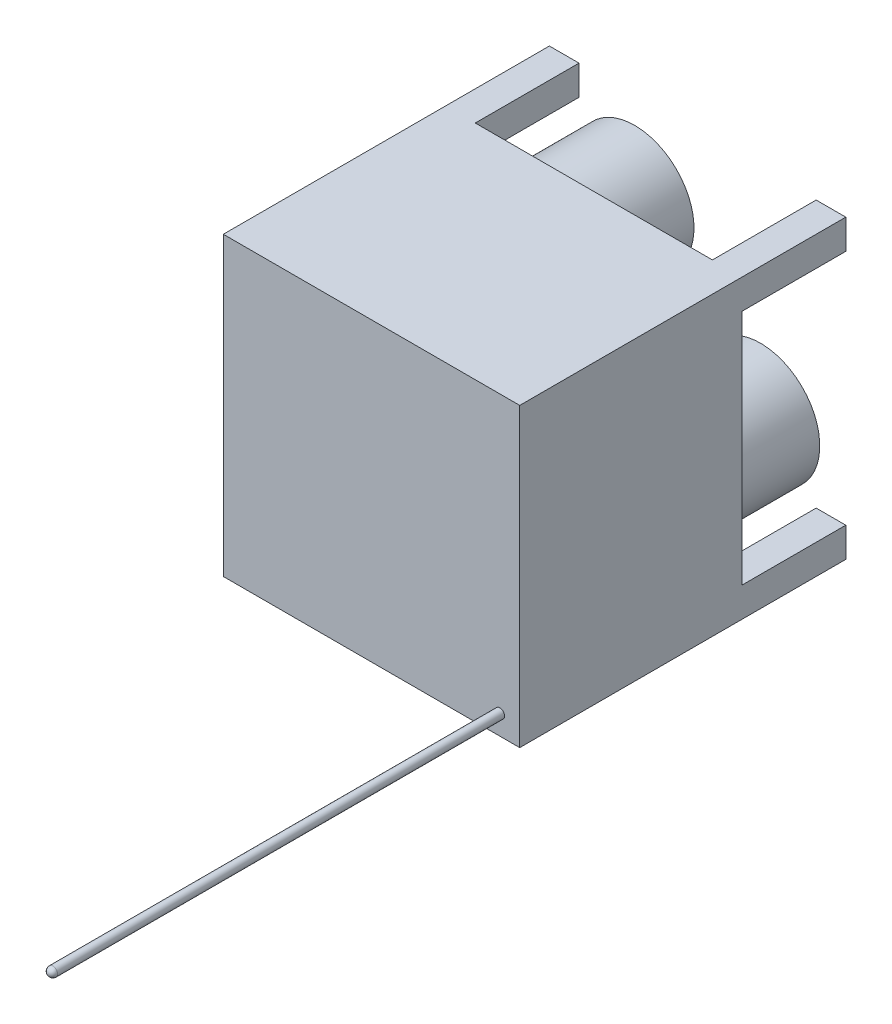
ISO-10303-21;
HEADER;
FILE_DESCRIPTION(('STEP AP214'),'2;1');
FILE_NAME('part.step','',(''),(''),'','','');
FILE_SCHEMA(('AUTOMOTIVE_DESIGN { 1 0 10303 214 1 1 1 1 }'));
ENDSEC;
DATA;
#1=APPLICATION_CONTEXT('core data for automotive mechanical design processes');
#2=APPLICATION_PROTOCOL_DEFINITION('international standard','automotive_design',2000,#1);
#3=PRODUCT_CONTEXT('',#1,'mechanical');
#4=PRODUCT('Part','Part','',(#3));
#5=PRODUCT_RELATED_PRODUCT_CATEGORY('part','',(#4));
#6=PRODUCT_DEFINITION_FORMATION('','',#4);
#7=PRODUCT_DEFINITION_CONTEXT('part definition',#1,'design');
#8=PRODUCT_DEFINITION('design','',#6,#7);
#9=PRODUCT_DEFINITION_SHAPE('','',#8);
#10=(LENGTH_UNIT() NAMED_UNIT(*) SI_UNIT(.MILLI.,.METRE.));
#11=(NAMED_UNIT(*) PLANE_ANGLE_UNIT() SI_UNIT($,.RADIAN.));
#12=(NAMED_UNIT(*) SI_UNIT($,.STERADIAN.) SOLID_ANGLE_UNIT());
#13=UNCERTAINTY_MEASURE_WITH_UNIT(LENGTH_MEASURE(1.E-05),#10,'distance_accuracy_value','');
#14=(GEOMETRIC_REPRESENTATION_CONTEXT(3) GLOBAL_UNCERTAINTY_ASSIGNED_CONTEXT((#13)) GLOBAL_UNIT_ASSIGNED_CONTEXT((#10,
#11,#12)) REPRESENTATION_CONTEXT('',''));
#15=CARTESIAN_POINT('',(0.,0.,0.));
#16=DIRECTION('',(0.,0.,1.));
#17=DIRECTION('',(1.,0.,0.));
#18=AXIS2_PLACEMENT_3D('',#15,#16,#17);
#19=CARTESIAN_POINT('',(-50.,50.,110.));
#20=DIRECTION('',(0.,-1.,0.));
#21=DIRECTION('',(0.,0.,-1.));
#22=AXIS2_PLACEMENT_3D('',#19,#20,#21);
#23=PLANE('',#22);
#24=DIRECTION('',(0.,0.,-1.));
#25=VECTOR('',#24,1.);
#26=CARTESIAN_POINT('',(40.,50.,35.));
#27=LINE('',#26,#25);
#28=CARTESIAN_POINT('',(40.,50.,35.));
#29=VERTEX_POINT('',#28);
#30=CARTESIAN_POINT('',(40.,50.,0.));
#31=VERTEX_POINT('',#30);
#32=EDGE_CURVE('E281',#29,#31,#27,.T.);
#33=ORIENTED_EDGE('',*,*,#32,.F.);
#34=DIRECTION('',(1.,0.,0.));
#35=VECTOR('',#34,1.);
#36=CARTESIAN_POINT('',(0.,50.,35.));
#37=LINE('',#36,#35);
#38=CARTESIAN_POINT('',(-40.,50.,35.));
#39=VERTEX_POINT('',#38);
#40=EDGE_CURVE('E187',#39,#29,#37,.T.);
#41=ORIENTED_EDGE('',*,*,#40,.F.);
#42=DIRECTION('',(0.,0.,-1.));
#43=VECTOR('',#42,1.);
#44=CARTESIAN_POINT('',(-40.,50.,35.));
#45=LINE('',#44,#43);
#46=CARTESIAN_POINT('',(-40.,50.,0.));
#47=VERTEX_POINT('',#46);
#48=EDGE_CURVE('E169',#39,#47,#45,.T.);
#49=ORIENTED_EDGE('',*,*,#48,.T.);
#50=DIRECTION('',(-1.,0.,0.));
#51=VECTOR('',#50,1.);
#52=CARTESIAN_POINT('',(-50.,50.,0.));
#53=LINE('',#52,#51);
#54=CARTESIAN_POINT('',(-50.,50.,0.));
#55=VERTEX_POINT('',#54);
#56=EDGE_CURVE('E302',#47,#55,#53,.T.);
#57=ORIENTED_EDGE('',*,*,#56,.T.);
#58=DIRECTION('',(0.,0.,-1.));
#59=VECTOR('',#58,1.);
#60=CARTESIAN_POINT('',(-50.,50.,110.));
#61=LINE('',#60,#59);
#62=CARTESIAN_POINT('',(-50.,50.,110.));
#63=VERTEX_POINT('',#62);
#64=EDGE_CURVE('E321',#63,#55,#61,.T.);
#65=ORIENTED_EDGE('',*,*,#64,.F.);
#66=DIRECTION('',(-1.,0.,0.));
#67=VECTOR('',#66,1.);
#68=CARTESIAN_POINT('',(-50.,50.,110.));
#69=LINE('',#68,#67);
#70=CARTESIAN_POINT('',(50.,50.,110.));
#71=VERTEX_POINT('',#70);
#72=EDGE_CURVE('E93',#71,#63,#69,.T.);
#73=ORIENTED_EDGE('',*,*,#72,.F.);
#74=DIRECTION('',(0.,0.,-1.));
#75=VECTOR('',#74,1.);
#76=CARTESIAN_POINT('',(50.,50.,110.));
#77=LINE('',#76,#75);
#78=CARTESIAN_POINT('',(50.,50.,0.));
#79=VERTEX_POINT('',#78);
#80=EDGE_CURVE('E325',#71,#79,#77,.T.);
#81=ORIENTED_EDGE('',*,*,#80,.T.);
#82=EDGE_CURVE('E303',#79,#31,#53,.T.);
#83=ORIENTED_EDGE('',*,*,#82,.T.);
#84=EDGE_LOOP('',(#33,#41,#49,#57,#65,#73,#81,#83));
#85=FACE_BOUND('',#84,.T.);
#86=ADVANCED_FACE('F39',(#85),#23,.F.);
#87=CARTESIAN_POINT('',(-50.,-50.,110.));
#88=DIRECTION('',(1.,0.,0.));
#89=DIRECTION('',(0.,0.,-1.));
#90=AXIS2_PLACEMENT_3D('',#87,#88,#89);
#91=PLANE('',#90);
#92=DIRECTION('',(0.,0.,-1.));
#93=VECTOR('',#92,1.);
#94=CARTESIAN_POINT('',(-50.,40.,35.));
#95=LINE('',#94,#93);
#96=CARTESIAN_POINT('',(-50.,40.,35.));
#97=VERTEX_POINT('',#96);
#98=CARTESIAN_POINT('',(-50.,40.,0.));
#99=VERTEX_POINT('',#98);
#100=EDGE_CURVE('E251',#97,#99,#95,.T.);
#101=ORIENTED_EDGE('',*,*,#100,.F.);
#102=DIRECTION('',(0.,1.,0.));
#103=VECTOR('',#102,1.);
#104=CARTESIAN_POINT('',(-50.,0.,35.));
#105=LINE('',#104,#103);
#106=CARTESIAN_POINT('',(-50.,-40.,35.));
#107=VERTEX_POINT('',#106);
#108=EDGE_CURVE('E170',#107,#97,#105,.T.);
#109=ORIENTED_EDGE('',*,*,#108,.F.);
#110=DIRECTION('',(0.,0.,-1.));
#111=VECTOR('',#110,1.);
#112=CARTESIAN_POINT('',(-50.,-40.,35.));
#113=LINE('',#112,#111);
#114=CARTESIAN_POINT('',(-50.,-40.,0.));
#115=VERTEX_POINT('',#114);
#116=EDGE_CURVE('E255',#107,#115,#113,.T.);
#117=ORIENTED_EDGE('',*,*,#116,.T.);
#118=DIRECTION('',(0.,-1.,0.));
#119=VECTOR('',#118,1.);
#120=CARTESIAN_POINT('',(-50.,-50.,0.));
#121=LINE('',#120,#119);
#122=CARTESIAN_POINT('',(-50.,-50.,0.));
#123=VERTEX_POINT('',#122);
#124=EDGE_CURVE('E307',#115,#123,#121,.T.);
#125=ORIENTED_EDGE('',*,*,#124,.T.);
#126=DIRECTION('',(0.,0.,-1.));
#127=VECTOR('',#126,1.);
#128=CARTESIAN_POINT('',(-50.,-50.,110.));
#129=LINE('',#128,#127);
#130=CARTESIAN_POINT('',(-50.,-50.,110.));
#131=VERTEX_POINT('',#130);
#132=EDGE_CURVE('E317',#131,#123,#129,.T.);
#133=ORIENTED_EDGE('',*,*,#132,.F.);
#134=DIRECTION('',(0.,-1.,0.));
#135=VECTOR('',#134,1.);
#136=CARTESIAN_POINT('',(-50.,-50.,110.));
#137=LINE('',#136,#135);
#138=EDGE_CURVE('E292',#63,#131,#137,.T.);
#139=ORIENTED_EDGE('',*,*,#138,.F.);
#140=ORIENTED_EDGE('',*,*,#64,.T.);
#141=EDGE_CURVE('E308',#55,#99,#121,.T.);
#142=ORIENTED_EDGE('',*,*,#141,.T.);
#143=EDGE_LOOP('',(#101,#109,#117,#125,#133,#139,#140,#142));
#144=FACE_BOUND('',#143,.T.);
#145=ADVANCED_FACE('F364',(#144),#91,.F.);
#146=CARTESIAN_POINT('',(0.,0.,0.));
#147=DIRECTION('',(0.,0.,-1.));
#148=DIRECTION('',(-1.,0.,0.));
#149=AXIS2_PLACEMENT_3D('',#146,#147,#148);
#150=PLANE('',#149);
#151=DIRECTION('',(1.,0.,0.));
#152=VECTOR('',#151,1.);
#153=CARTESIAN_POINT('',(-50.,-50.,0.));
#154=LINE('',#153,#152);
#155=CARTESIAN_POINT('',(40.,-50.,0.));
#156=VERTEX_POINT('',#155);
#157=CARTESIAN_POINT('',(50.,-50.,0.));
#158=VERTEX_POINT('',#157);
#159=EDGE_CURVE('E85',#156,#158,#154,.T.);
#160=ORIENTED_EDGE('',*,*,#159,.F.);
#161=DIRECTION('',(0.,1.,0.));
#162=VECTOR('',#161,1.);
#163=CARTESIAN_POINT('',(40.,0.,0.));
#164=LINE('',#163,#162);
#165=CARTESIAN_POINT('',(40.,-40.,0.));
#166=VERTEX_POINT('',#165);
#167=EDGE_CURVE('E241',#156,#166,#164,.T.);
#168=ORIENTED_EDGE('',*,*,#167,.T.);
#169=DIRECTION('',(-1.,0.,0.));
#170=VECTOR('',#169,1.);
#171=CARTESIAN_POINT('',(0.,-40.,0.));
#172=LINE('',#171,#170);
#173=CARTESIAN_POINT('',(50.,-40.,0.));
#174=VERTEX_POINT('',#173);
#175=EDGE_CURVE('E237',#174,#166,#172,.T.);
#176=ORIENTED_EDGE('',*,*,#175,.F.);
#177=DIRECTION('',(0.,1.,0.));
#178=VECTOR('',#177,1.);
#179=CARTESIAN_POINT('',(50.,-50.,0.));
#180=LINE('',#179,#178);
#181=EDGE_CURVE('E298',#158,#174,#180,.T.);
#182=ORIENTED_EDGE('',*,*,#181,.F.);
#183=EDGE_LOOP('',(#160,#168,#176,#182));
#184=FACE_BOUND('',#183,.T.);
#185=ADVANCED_FACE('F385',(#184),#150,.T.);
#186=CARTESIAN_POINT('',(50.,40.,0.));
#187=VERTEX_POINT('',#186);
#188=EDGE_CURVE('E254',#187,#79,#180,.T.);
#189=ORIENTED_EDGE('',*,*,#188,.F.);
#190=DIRECTION('',(-1.,0.,0.));
#191=VECTOR('',#190,1.);
#192=CARTESIAN_POINT('',(0.,40.,0.));
#193=LINE('',#192,#191);
#194=CARTESIAN_POINT('',(40.,40.,0.));
#195=VERTEX_POINT('',#194);
#196=EDGE_CURVE('E233',#187,#195,#193,.T.);
#197=ORIENTED_EDGE('',*,*,#196,.T.);
#198=DIRECTION('',(0.,1.,0.));
#199=VECTOR('',#198,1.);
#200=CARTESIAN_POINT('',(40.,0.,0.));
#201=LINE('',#200,#199);
#202=EDGE_CURVE('E229',#195,#31,#201,.T.);
#203=ORIENTED_EDGE('',*,*,#202,.T.);
#204=ORIENTED_EDGE('',*,*,#82,.F.);
#205=EDGE_LOOP('',(#189,#197,#203,#204));
#206=FACE_BOUND('',#205,.T.);
#207=ADVANCED_FACE('F346',(#206),#150,.T.);
#208=DIRECTION('',(0.,1.,0.));
#209=VECTOR('',#208,1.);
#210=CARTESIAN_POINT('',(-40.,0.,0.));
#211=LINE('',#210,#209);
#212=CARTESIAN_POINT('',(-40.,40.,0.));
#213=VERTEX_POINT('',#212);
#214=EDGE_CURVE('E225',#213,#47,#211,.T.);
#215=ORIENTED_EDGE('',*,*,#214,.F.);
#216=DIRECTION('',(-1.,0.,0.));
#217=VECTOR('',#216,1.);
#218=CARTESIAN_POINT('',(0.,40.,0.));
#219=LINE('',#218,#217);
#220=EDGE_CURVE('E55',#213,#99,#219,.T.);
#221=ORIENTED_EDGE('',*,*,#220,.T.);
#222=ORIENTED_EDGE('',*,*,#141,.F.);
#223=ORIENTED_EDGE('',*,*,#56,.F.);
#224=EDGE_LOOP('',(#215,#221,#222,#223));
#225=FACE_BOUND('',#224,.T.);
#226=ADVANCED_FACE('F356',(#225),#150,.T.);
#227=CARTESIAN_POINT('',(50.,-50.,110.));
#228=DIRECTION('',(-1.,0.,0.));
#229=DIRECTION('',(0.,0.,1.));
#230=AXIS2_PLACEMENT_3D('',#227,#228,#229);
#231=PLANE('',#230);
#232=ORIENTED_EDGE('',*,*,#181,.T.);
#233=DIRECTION('',(0.,0.,-1.));
#234=VECTOR('',#233,1.);
#235=CARTESIAN_POINT('',(50.,-40.,35.));
#236=LINE('',#235,#234);
#237=CARTESIAN_POINT('',(50.,-40.,35.));
#238=VERTEX_POINT('',#237);
#239=EDGE_CURVE('E271',#238,#174,#236,.T.);
#240=ORIENTED_EDGE('',*,*,#239,.F.);
#241=DIRECTION('',(0.,-1.,0.));
#242=VECTOR('',#241,1.);
#243=CARTESIAN_POINT('',(50.,0.,35.));
#244=LINE('',#243,#242);
#245=CARTESIAN_POINT('',(50.,40.,35.));
#246=VERTEX_POINT('',#245);
#247=EDGE_CURVE('E199',#246,#238,#244,.T.);
#248=ORIENTED_EDGE('',*,*,#247,.F.);
#249=DIRECTION('',(0.,0.,-1.));
#250=VECTOR('',#249,1.);
#251=CARTESIAN_POINT('',(50.,40.,35.));
#252=LINE('',#251,#250);
#253=EDGE_CURVE('E274',#246,#187,#252,.T.);
#254=ORIENTED_EDGE('',*,*,#253,.T.);
#255=ORIENTED_EDGE('',*,*,#188,.T.);
#256=ORIENTED_EDGE('',*,*,#80,.F.);
#257=DIRECTION('',(0.,1.,0.));
#258=VECTOR('',#257,1.);
#259=CARTESIAN_POINT('',(50.,-50.,110.));
#260=LINE('',#259,#258);
#261=CARTESIAN_POINT('',(50.,-50.,110.));
#262=VERTEX_POINT('',#261);
#263=EDGE_CURVE('E286',#262,#71,#260,.T.);
#264=ORIENTED_EDGE('',*,*,#263,.F.);
#265=DIRECTION('',(0.,0.,-1.));
#266=VECTOR('',#265,1.);
#267=CARTESIAN_POINT('',(50.,-50.,110.));
#268=LINE('',#267,#266);
#269=EDGE_CURVE('E297',#262,#158,#268,.T.);
#270=ORIENTED_EDGE('',*,*,#269,.T.);
#271=EDGE_LOOP('',(#232,#240,#248,#254,#255,#256,#264,#270));
#272=FACE_BOUND('',#271,.T.);
#273=ADVANCED_FACE('F341',(#272),#231,.F.);
#274=CARTESIAN_POINT('',(-50.,-50.,110.));
#275=DIRECTION('',(0.,1.,0.));
#276=DIRECTION('',(0.,0.,1.));
#277=AXIS2_PLACEMENT_3D('',#274,#275,#276);
#278=PLANE('',#277);
#279=CARTESIAN_POINT('',(-40.,-50.,0.));
#280=VERTEX_POINT('',#279);
#281=EDGE_CURVE('E289',#123,#280,#154,.T.);
#282=ORIENTED_EDGE('',*,*,#281,.T.);
#283=DIRECTION('',(0.,0.,-1.));
#284=VECTOR('',#283,1.);
#285=CARTESIAN_POINT('',(-40.,-50.,35.));
#286=LINE('',#285,#284);
#287=CARTESIAN_POINT('',(-40.,-50.,35.));
#288=VERTEX_POINT('',#287);
#289=EDGE_CURVE('E262',#288,#280,#286,.T.);
#290=ORIENTED_EDGE('',*,*,#289,.F.);
#291=DIRECTION('',(-1.,0.,0.));
#292=VECTOR('',#291,1.);
#293=CARTESIAN_POINT('',(0.,-50.,35.));
#294=LINE('',#293,#292);
#295=CARTESIAN_POINT('',(40.,-50.,35.));
#296=VERTEX_POINT('',#295);
#297=EDGE_CURVE('E210',#296,#288,#294,.T.);
#298=ORIENTED_EDGE('',*,*,#297,.F.);
#299=DIRECTION('',(0.,0.,-1.));
#300=VECTOR('',#299,1.);
#301=CARTESIAN_POINT('',(40.,-50.,35.));
#302=LINE('',#301,#300);
#303=EDGE_CURVE('E265',#296,#156,#302,.T.);
#304=ORIENTED_EDGE('',*,*,#303,.T.);
#305=ORIENTED_EDGE('',*,*,#159,.T.);
#306=ORIENTED_EDGE('',*,*,#269,.F.);
#307=DIRECTION('',(1.,0.,0.));
#308=VECTOR('',#307,1.);
#309=CARTESIAN_POINT('',(-50.,-50.,110.));
#310=LINE('',#309,#308);
#311=EDGE_CURVE('E64',#131,#262,#310,.T.);
#312=ORIENTED_EDGE('',*,*,#311,.F.);
#313=ORIENTED_EDGE('',*,*,#132,.T.);
#314=EDGE_LOOP('',(#282,#290,#298,#304,#305,#306,#312,#313));
#315=FACE_BOUND('',#314,.T.);
#316=ADVANCED_FACE('F336',(#315),#278,.F.);
#317=CARTESIAN_POINT('',(0.,0.,110.));
#318=DIRECTION('',(0.,0.,-1.));
#319=DIRECTION('',(-1.,0.,0.));
#320=AXIS2_PLACEMENT_3D('',#317,#318,#319);
#321=PLANE('',#320);
#322=CARTESIAN_POINT('',(43.2986468594549,-43.3098952316584,110.));
#323=DIRECTION('',(0.,0.,-1.));
#324=DIRECTION('',(-1.,0.,0.));
#325=AXIS2_PLACEMENT_3D('',#322,#323,#324);
#326=CIRCLE('',#325,1.5875);
#327=CARTESIAN_POINT('',(41.7111468594549,-43.3098952316584,110.));
#328=VERTEX_POINT('',#327);
#329=EDGE_CURVE('E48',#328,#328,#326,.F.);
#330=ORIENTED_EDGE('',*,*,#329,.F.);
#331=EDGE_LOOP('',(#330));
#332=FACE_BOUND('',#331,.T.);
#333=ORIENTED_EDGE('',*,*,#263,.T.);
#334=ORIENTED_EDGE('',*,*,#72,.T.);
#335=ORIENTED_EDGE('',*,*,#138,.T.);
#336=ORIENTED_EDGE('',*,*,#311,.T.);
#337=EDGE_LOOP('',(#333,#334,#335,#336));
#338=FACE_BOUND('',#337,.T.);
#339=ADVANCED_FACE('F333',(#332,#338),#321,.F.);
#340=DIRECTION('',(-1.,0.,0.));
#341=VECTOR('',#340,1.);
#342=CARTESIAN_POINT('',(0.,-40.,0.));
#343=LINE('',#342,#341);
#344=CARTESIAN_POINT('',(-40.,-40.,0.));
#345=VERTEX_POINT('',#344);
#346=EDGE_CURVE('E182',#345,#115,#343,.T.);
#347=ORIENTED_EDGE('',*,*,#346,.F.);
#348=DIRECTION('',(0.,1.,0.));
#349=VECTOR('',#348,1.);
#350=CARTESIAN_POINT('',(-40.,0.,0.));
#351=LINE('',#350,#349);
#352=EDGE_CURVE('E245',#280,#345,#351,.T.);
#353=ORIENTED_EDGE('',*,*,#352,.F.);
#354=ORIENTED_EDGE('',*,*,#281,.F.);
#355=ORIENTED_EDGE('',*,*,#124,.F.);
#356=EDGE_LOOP('',(#347,#353,#354,#355));
#357=FACE_BOUND('',#356,.T.);
#358=ADVANCED_FACE('F335',(#357),#150,.T.);
#359=CARTESIAN_POINT('',(43.2986468594549,-43.3098952316584,262.4));
#360=DIRECTION('',(0.,0.,-1.));
#361=DIRECTION('',(-1.,0.,0.));
#362=AXIS2_PLACEMENT_3D('',#359,#360,#361);
#363=CYLINDRICAL_SURFACE('',#362,1.5875);
#364=CARTESIAN_POINT('',(43.2986468594549,-43.3098952316584,260.8125));
#365=DIRECTION('',(0.,0.,-1.));
#366=DIRECTION('',(-1.,0.,0.));
#367=AXIS2_PLACEMENT_3D('',#364,#365,#366);
#368=CIRCLE('',#367,1.5875);
#369=CARTESIAN_POINT('',(41.7111468594549,-43.3098952316584,260.8125));
#370=VERTEX_POINT('',#369);
#371=EDGE_CURVE('E11',#370,#370,#368,.T.);
#372=CARTESIAN_POINT('',(41.7111468594549,-43.3098952316584,260.8125));
#373=CARTESIAN_POINT('',(41.7111468594549,-43.3098952316584,259.241536458333));
#374=CARTESIAN_POINT('',(41.7111468594549,-43.3098952316584,257.670572916667));
#375=CARTESIAN_POINT('',(41.7111468594549,-43.3098952316584,254.528645833333));
#376=CARTESIAN_POINT('',(41.7111468594549,-43.3098952316584,252.957682291667));
#377=CARTESIAN_POINT('',(41.7111468594549,-43.3098952316584,249.815755208333));
#378=CARTESIAN_POINT('',(41.7111468594549,-43.3098952316584,248.244791666667));
#379=CARTESIAN_POINT('',(41.7111468594549,-43.3098952316584,245.102864583333));
#380=CARTESIAN_POINT('',(41.7111468594549,-43.3098952316584,243.531901041667));
#381=CARTESIAN_POINT('',(41.7111468594549,-43.3098952316584,240.389973958333));
#382=CARTESIAN_POINT('',(41.7111468594549,-43.3098952316584,238.819010416667));
#383=CARTESIAN_POINT('',(41.7111468594549,-43.3098952316584,235.677083333333));
#384=CARTESIAN_POINT('',(41.7111468594549,-43.3098952316584,234.106119791667));
#385=CARTESIAN_POINT('',(41.7111468594549,-43.3098952316584,230.964192708333));
#386=CARTESIAN_POINT('',(41.7111468594549,-43.3098952316584,229.393229166667));
#387=CARTESIAN_POINT('',(41.7111468594549,-43.3098952316584,226.251302083333));
#388=CARTESIAN_POINT('',(41.7111468594549,-43.3098952316584,224.680338541667));
#389=CARTESIAN_POINT('',(41.7111468594549,-43.3098952316584,221.538411458333));
#390=CARTESIAN_POINT('',(41.7111468594549,-43.3098952316584,219.967447916667));
#391=CARTESIAN_POINT('',(41.7111468594549,-43.3098952316584,216.825520833333));
#392=CARTESIAN_POINT('',(41.7111468594549,-43.3098952316584,215.254557291667));
#393=CARTESIAN_POINT('',(41.7111468594549,-43.3098952316584,212.112630208333));
#394=CARTESIAN_POINT('',(41.7111468594549,-43.3098952316584,210.541666666667));
#395=CARTESIAN_POINT('',(41.7111468594549,-43.3098952316584,207.399739583333));
#396=CARTESIAN_POINT('',(41.7111468594549,-43.3098952316584,205.828776041667));
#397=CARTESIAN_POINT('',(41.7111468594549,-43.3098952316584,202.686848958333));
#398=CARTESIAN_POINT('',(41.7111468594549,-43.3098952316584,201.115885416667));
#399=CARTESIAN_POINT('',(41.7111468594549,-43.3098952316584,197.973958333333));
#400=CARTESIAN_POINT('',(41.7111468594549,-43.3098952316584,196.402994791667));
#401=CARTESIAN_POINT('',(41.7111468594549,-43.3098952316584,193.261067708333));
#402=CARTESIAN_POINT('',(41.7111468594549,-43.3098952316584,191.690104166667));
#403=CARTESIAN_POINT('',(41.7111468594549,-43.3098952316584,188.548177083333));
#404=CARTESIAN_POINT('',(41.7111468594549,-43.3098952316584,186.977213541667));
#405=CARTESIAN_POINT('',(41.7111468594549,-43.3098952316584,183.835286458333));
#406=CARTESIAN_POINT('',(41.7111468594549,-43.3098952316584,182.264322916667));
#407=CARTESIAN_POINT('',(41.7111468594549,-43.3098952316584,179.122395833333));
#408=CARTESIAN_POINT('',(41.7111468594549,-43.3098952316584,177.551432291667));
#409=CARTESIAN_POINT('',(41.7111468594549,-43.3098952316584,174.409505208333));
#410=CARTESIAN_POINT('',(41.7111468594549,-43.3098952316584,172.838541666667));
#411=CARTESIAN_POINT('',(41.7111468594549,-43.3098952316584,169.696614583333));
#412=CARTESIAN_POINT('',(41.7111468594549,-43.3098952316584,168.125651041667));
#413=CARTESIAN_POINT('',(41.7111468594549,-43.3098952316584,164.983723958333));
#414=CARTESIAN_POINT('',(41.7111468594549,-43.3098952316584,163.412760416667));
#415=CARTESIAN_POINT('',(41.7111468594549,-43.3098952316584,160.270833333333));
#416=CARTESIAN_POINT('',(41.7111468594549,-43.3098952316584,158.699869791667));
#417=CARTESIAN_POINT('',(41.7111468594549,-43.3098952316584,155.557942708333));
#418=CARTESIAN_POINT('',(41.7111468594549,-43.3098952316584,153.986979166667));
#419=CARTESIAN_POINT('',(41.7111468594549,-43.3098952316584,150.845052083333));
#420=CARTESIAN_POINT('',(41.7111468594549,-43.3098952316584,149.274088541667));
#421=CARTESIAN_POINT('',(41.7111468594549,-43.3098952316584,146.132161458333));
#422=CARTESIAN_POINT('',(41.7111468594549,-43.3098952316584,144.561197916667));
#423=CARTESIAN_POINT('',(41.7111468594549,-43.3098952316584,141.419270833333));
#424=CARTESIAN_POINT('',(41.7111468594549,-43.3098952316584,139.848307291667));
#425=CARTESIAN_POINT('',(41.7111468594549,-43.3098952316584,136.706380208333));
#426=CARTESIAN_POINT('',(41.7111468594549,-43.3098952316584,135.135416666667));
#427=CARTESIAN_POINT('',(41.7111468594549,-43.3098952316584,131.993489583333));
#428=CARTESIAN_POINT('',(41.7111468594549,-43.3098952316584,130.422526041667));
#429=CARTESIAN_POINT('',(41.7111468594549,-43.3098952316584,127.280598958333));
#430=CARTESIAN_POINT('',(41.7111468594549,-43.3098952316584,125.709635416667));
#431=CARTESIAN_POINT('',(41.7111468594549,-43.3098952316584,122.567708333333));
#432=CARTESIAN_POINT('',(41.7111468594549,-43.3098952316584,120.996744791667));
#433=CARTESIAN_POINT('',(41.7111468594549,-43.3098952316584,117.854817708333));
#434=CARTESIAN_POINT('',(41.7111468594549,-43.3098952316584,116.283854166667));
#435=CARTESIAN_POINT('',(41.7111468594549,-43.3098952316584,113.141927083333));
#436=CARTESIAN_POINT('',(41.7111468594549,-43.3098952316584,111.570963541667));
#437=CARTESIAN_POINT('',(41.7111468594549,-43.3098952316584,110.));
#438=B_SPLINE_CURVE_WITH_KNOTS('',3,(#372,#373,#374,#375,#376,#377,#378,#379,#380,#381,#382,
#383,#384,#385,#386,#387,#388,#389,#390,#391,#392,#393,#394,#395,#396,#397,#398,#399,#400,#401,
#402,#403,#404,#405,#406,#407,#408,#409,#410,#411,#412,#413,#414,#415,#416,#417,#418,#419,#420,
#421,#422,#423,#424,#425,#426,#427,#428,#429,#430,#431,#432,#433,#434,#435,#436,#437),
.UNSPECIFIED.,.F.,.F.,(4,2,2,2,2,2,2,2,2,2,2,2,2,2,2,2,2,2,2,2,2,2,2,2,2,2,2,2,2,2,2,2,4),(0.,
4.71289062500002,9.42578125000004,14.138671875,18.8515625,23.564453125,28.27734375,32.990234375,
37.703125,42.416015625,47.12890625,51.841796875,56.5546875,61.2675781250001,65.98046875,
70.693359375,75.40625,80.119140625,84.8320312500001,89.544921875,94.2578125,98.9707031250001,
103.68359375,108.396484375,113.109375,117.822265625,122.53515625,127.248046875,131.9609375,
136.673828125,141.38671875,146.099609375,150.8125),.UNSPECIFIED.);
#439=EDGE_CURVE('BSEAM331',#370,#328,#438,.T.);
#440=ORIENTED_EDGE('',*,*,#371,.T.);
#441=ORIENTED_EDGE('',*,*,#329,.T.);
#442=ORIENTED_EDGE('',*,*,#439,.T.);
#443=ORIENTED_EDGE('',*,*,#439,.F.);
#444=EDGE_LOOP('',(#440,#442,#441,#443));
#445=FACE_BOUND('',#444,.T.);
#446=ADVANCED_FACE('F331',(#445),#363,.T.);
#447=CARTESIAN_POINT('',(43.2986468594549,-43.3098952316584,260.8125));
#448=DIRECTION('',(0.,0.,1.));
#449=DIRECTION('',(1.,0.,0.));
#450=AXIS2_PLACEMENT_3D('',#447,#448,#449);
#451=SPHERICAL_SURFACE('',#450,1.5875);
#452=ORIENTED_EDGE('',*,*,#371,.F.);
#453=EDGE_LOOP('',(#452));
#454=FACE_BOUND('',#453,.T.);
#455=ADVANCED_FACE('F41',(#454),#451,.T.);
#456=CARTESIAN_POINT('',(0.,40.,35.));
#457=DIRECTION('',(0.,-1.,0.));
#458=DIRECTION('',(0.,0.,-1.));
#459=AXIS2_PLACEMENT_3D('',#456,#457,#458);
#460=PLANE('',#459);
#461=ORIENTED_EDGE('',*,*,#220,.F.);
#462=DIRECTION('',(0.,0.,-1.));
#463=VECTOR('',#462,1.);
#464=CARTESIAN_POINT('',(-40.,40.,35.));
#465=LINE('',#464,#463);
#466=CARTESIAN_POINT('',(-40.,40.,35.));
#467=VERTEX_POINT('',#466);
#468=EDGE_CURVE('E160',#467,#213,#465,.T.);
#469=ORIENTED_EDGE('',*,*,#468,.F.);
#470=DIRECTION('',(-1.,0.,0.));
#471=VECTOR('',#470,1.);
#472=CARTESIAN_POINT('',(0.,40.,35.));
#473=LINE('',#472,#471);
#474=EDGE_CURVE('E163',#467,#97,#473,.T.);
#475=ORIENTED_EDGE('',*,*,#474,.T.);
#476=ORIENTED_EDGE('',*,*,#100,.T.);
#477=EDGE_LOOP('',(#461,#469,#475,#476));
#478=FACE_BOUND('',#477,.T.);
#479=ADVANCED_FACE('F162',(#478),#460,.T.);
#480=CARTESIAN_POINT('',(0.,-40.,35.));
#481=DIRECTION('',(0.,-1.,0.));
#482=DIRECTION('',(0.,0.,-1.));
#483=AXIS2_PLACEMENT_3D('',#480,#481,#482);
#484=PLANE('',#483);
#485=ORIENTED_EDGE('',*,*,#346,.T.);
#486=ORIENTED_EDGE('',*,*,#116,.F.);
#487=DIRECTION('',(-1.,0.,0.));
#488=VECTOR('',#487,1.);
#489=CARTESIAN_POINT('',(0.,-40.,35.));
#490=LINE('',#489,#488);
#491=CARTESIAN_POINT('',(-40.,-40.,35.));
#492=VERTEX_POINT('',#491);
#493=EDGE_CURVE('E218',#492,#107,#490,.T.);
#494=ORIENTED_EDGE('',*,*,#493,.F.);
#495=DIRECTION('',(0.,0.,-1.));
#496=VECTOR('',#495,1.);
#497=CARTESIAN_POINT('',(-40.,-40.,35.));
#498=LINE('',#497,#496);
#499=EDGE_CURVE('E259',#492,#345,#498,.T.);
#500=ORIENTED_EDGE('',*,*,#499,.T.);
#501=EDGE_LOOP('',(#485,#486,#494,#500));
#502=FACE_BOUND('',#501,.T.);
#503=ADVANCED_FACE('F458',(#502),#484,.F.);
#504=CARTESIAN_POINT('',(-40.,0.,35.));
#505=DIRECTION('',(-1.,0.,0.));
#506=DIRECTION('',(0.,0.,1.));
#507=AXIS2_PLACEMENT_3D('',#504,#505,#506);
#508=PLANE('',#507);
#509=ORIENTED_EDGE('',*,*,#352,.T.);
#510=ORIENTED_EDGE('',*,*,#499,.F.);
#511=DIRECTION('',(0.,1.,0.));
#512=VECTOR('',#511,1.);
#513=CARTESIAN_POINT('',(-40.,0.,35.));
#514=LINE('',#513,#512);
#515=EDGE_CURVE('E214',#288,#492,#514,.T.);
#516=ORIENTED_EDGE('',*,*,#515,.F.);
#517=ORIENTED_EDGE('',*,*,#289,.T.);
#518=EDGE_LOOP('',(#509,#510,#516,#517));
#519=FACE_BOUND('',#518,.T.);
#520=ADVANCED_FACE('F372',(#519),#508,.F.);
#521=CARTESIAN_POINT('',(40.,0.,35.));
#522=DIRECTION('',(-1.,0.,0.));
#523=DIRECTION('',(0.,0.,1.));
#524=AXIS2_PLACEMENT_3D('',#521,#522,#523);
#525=PLANE('',#524);
#526=ORIENTED_EDGE('',*,*,#167,.F.);
#527=ORIENTED_EDGE('',*,*,#303,.F.);
#528=DIRECTION('',(0.,1.,0.));
#529=VECTOR('',#528,1.);
#530=CARTESIAN_POINT('',(40.,0.,35.));
#531=LINE('',#530,#529);
#532=CARTESIAN_POINT('',(40.,-40.,35.));
#533=VERTEX_POINT('',#532);
#534=EDGE_CURVE('E207',#296,#533,#531,.T.);
#535=ORIENTED_EDGE('',*,*,#534,.T.);
#536=DIRECTION('',(0.,0.,-1.));
#537=VECTOR('',#536,1.);
#538=CARTESIAN_POINT('',(40.,-40.,35.));
#539=LINE('',#538,#537);
#540=EDGE_CURVE('E268',#533,#166,#539,.T.);
#541=ORIENTED_EDGE('',*,*,#540,.T.);
#542=EDGE_LOOP('',(#526,#527,#535,#541));
#543=FACE_BOUND('',#542,.T.);
#544=ADVANCED_FACE('F378',(#543),#525,.T.);
#545=CARTESIAN_POINT('',(0.,-40.,35.));
#546=DIRECTION('',(0.,-1.,0.));
#547=DIRECTION('',(0.,0.,-1.));
#548=AXIS2_PLACEMENT_3D('',#545,#546,#547);
#549=PLANE('',#548);
#550=ORIENTED_EDGE('',*,*,#175,.T.);
#551=ORIENTED_EDGE('',*,*,#540,.F.);
#552=DIRECTION('',(-1.,0.,0.));
#553=VECTOR('',#552,1.);
#554=CARTESIAN_POINT('',(0.,-40.,35.));
#555=LINE('',#554,#553);
#556=EDGE_CURVE('E203',#238,#533,#555,.T.);
#557=ORIENTED_EDGE('',*,*,#556,.F.);
#558=ORIENTED_EDGE('',*,*,#239,.T.);
#559=EDGE_LOOP('',(#550,#551,#557,#558));
#560=FACE_BOUND('',#559,.T.);
#561=ADVANCED_FACE('F380',(#560),#549,.F.);
#562=CARTESIAN_POINT('',(0.,40.,35.));
#563=DIRECTION('',(0.,-1.,0.));
#564=DIRECTION('',(0.,0.,-1.));
#565=AXIS2_PLACEMENT_3D('',#562,#563,#564);
#566=PLANE('',#565);
#567=ORIENTED_EDGE('',*,*,#196,.F.);
#568=ORIENTED_EDGE('',*,*,#253,.F.);
#569=DIRECTION('',(-1.,0.,0.));
#570=VECTOR('',#569,1.);
#571=CARTESIAN_POINT('',(0.,40.,35.));
#572=LINE('',#571,#570);
#573=CARTESIAN_POINT('',(40.,40.,35.));
#574=VERTEX_POINT('',#573);
#575=EDGE_CURVE('E196',#246,#574,#572,.T.);
#576=ORIENTED_EDGE('',*,*,#575,.T.);
#577=DIRECTION('',(0.,0.,-1.));
#578=VECTOR('',#577,1.);
#579=CARTESIAN_POINT('',(40.,40.,35.));
#580=LINE('',#579,#578);
#581=EDGE_CURVE('E278',#574,#195,#580,.T.);
#582=ORIENTED_EDGE('',*,*,#581,.T.);
#583=EDGE_LOOP('',(#567,#568,#576,#582));
#584=FACE_BOUND('',#583,.T.);
#585=ADVANCED_FACE('F388',(#584),#566,.T.);
#586=CARTESIAN_POINT('',(40.,0.,35.));
#587=DIRECTION('',(-1.,0.,0.));
#588=DIRECTION('',(0.,0.,1.));
#589=AXIS2_PLACEMENT_3D('',#586,#587,#588);
#590=PLANE('',#589);
#591=ORIENTED_EDGE('',*,*,#202,.F.);
#592=ORIENTED_EDGE('',*,*,#581,.F.);
#593=DIRECTION('',(0.,1.,0.));
#594=VECTOR('',#593,1.);
#595=CARTESIAN_POINT('',(40.,0.,35.));
#596=LINE('',#595,#594);
#597=EDGE_CURVE('E190',#574,#29,#596,.T.);
#598=ORIENTED_EDGE('',*,*,#597,.T.);
#599=ORIENTED_EDGE('',*,*,#32,.T.);
#600=EDGE_LOOP('',(#591,#592,#598,#599));
#601=FACE_BOUND('',#600,.T.);
#602=ADVANCED_FACE('F350',(#601),#590,.T.);
#603=CARTESIAN_POINT('',(-40.,0.,35.));
#604=DIRECTION('',(-1.,0.,0.));
#605=DIRECTION('',(0.,0.,1.));
#606=AXIS2_PLACEMENT_3D('',#603,#604,#605);
#607=PLANE('',#606);
#608=ORIENTED_EDGE('',*,*,#214,.T.);
#609=ORIENTED_EDGE('',*,*,#48,.F.);
#610=DIRECTION('',(0.,1.,0.));
#611=VECTOR('',#610,1.);
#612=CARTESIAN_POINT('',(-40.,0.,35.));
#613=LINE('',#612,#611);
#614=EDGE_CURVE('E176',#467,#39,#613,.T.);
#615=ORIENTED_EDGE('',*,*,#614,.F.);
#616=ORIENTED_EDGE('',*,*,#468,.T.);
#617=EDGE_LOOP('',(#608,#609,#615,#616));
#618=FACE_BOUND('',#617,.T.);
#619=ADVANCED_FACE('F184',(#618),#607,.F.);
#620=CARTESIAN_POINT('',(0.,0.,35.));
#621=DIRECTION('',(0.,0.,-1.));
#622=DIRECTION('',(-1.,0.,0.));
#623=AXIS2_PLACEMENT_3D('',#620,#621,#622);
#624=PLANE('',#623);
#625=CARTESIAN_POINT('',(21.2132034355964,-21.2132034355964,35.));
#626=DIRECTION('',(0.,0.,-1.));
#627=DIRECTION('',(-1.,0.,0.));
#628=AXIS2_PLACEMENT_3D('',#625,#626,#627);
#629=CIRCLE('',#628,20.);
#630=CARTESIAN_POINT('',(1.21320343559642,-21.2132034355964,35.));
#631=VERTEX_POINT('',#630);
#632=EDGE_CURVE('E569',#631,#631,#629,.T.);
#633=ORIENTED_EDGE('',*,*,#632,.F.);
#634=EDGE_LOOP('',(#633));
#635=FACE_BOUND('',#634,.T.);
#636=CARTESIAN_POINT('',(-21.2132034355964,21.2132034355964,35.));
#637=DIRECTION('',(0.,0.,-1.));
#638=DIRECTION('',(-1.,0.,0.));
#639=AXIS2_PLACEMENT_3D('',#636,#637,#638);
#640=CIRCLE('',#639,20.);
#641=CARTESIAN_POINT('',(-41.2132034355964,21.2132034355964,35.));
#642=VERTEX_POINT('',#641);
#643=EDGE_CURVE('E573',#642,#642,#640,.T.);
#644=ORIENTED_EDGE('',*,*,#643,.F.);
#645=EDGE_LOOP('',(#644));
#646=FACE_BOUND('',#645,.T.);
#647=ORIENTED_EDGE('',*,*,#474,.F.);
#648=ORIENTED_EDGE('',*,*,#614,.T.);
#649=ORIENTED_EDGE('',*,*,#40,.T.);
#650=ORIENTED_EDGE('',*,*,#597,.F.);
#651=ORIENTED_EDGE('',*,*,#575,.F.);
#652=ORIENTED_EDGE('',*,*,#247,.T.);
#653=ORIENTED_EDGE('',*,*,#556,.T.);
#654=ORIENTED_EDGE('',*,*,#534,.F.);
#655=ORIENTED_EDGE('',*,*,#297,.T.);
#656=ORIENTED_EDGE('',*,*,#515,.T.);
#657=ORIENTED_EDGE('',*,*,#493,.T.);
#658=ORIENTED_EDGE('',*,*,#108,.T.);
#659=EDGE_LOOP('',(#647,#648,#649,#650,#651,#652,#653,#654,#655,#656,#657,#658));
#660=FACE_BOUND('',#659,.T.);
#661=ADVANCED_FACE('F174',(#635,#646,#660),#624,.T.);
#662=CARTESIAN_POINT('',(-21.2132034355964,21.2132034355964,-56.5685424949238));
#663=DIRECTION('',(0.,0.,1.));
#664=DIRECTION('',(1.,0.,0.));
#665=AXIS2_PLACEMENT_3D('',#662,#663,#664);
#666=CYLINDRICAL_SURFACE('',#665,20.);
#667=ORIENTED_EDGE('',*,*,#643,.T.);
#668=EDGE_LOOP('',(#667));
#669=FACE_BOUND('',#668,.T.);
#670=CARTESIAN_POINT('',(-21.2132034355964,21.2132034355964,0.));
#671=DIRECTION('',(0.,0.,-1.));
#672=DIRECTION('',(-1.,0.,0.));
#673=AXIS2_PLACEMENT_3D('',#670,#671,#672);
#674=CIRCLE('',#673,20.);
#675=CARTESIAN_POINT('',(-41.2132034355964,21.2132034355964,0.));
#676=VERTEX_POINT('',#675);
#677=EDGE_CURVE('E226',#676,#676,#674,.T.);
#678=ORIENTED_EDGE('',*,*,#677,.F.);
#679=EDGE_LOOP('',(#678));
#680=FACE_BOUND('',#679,.T.);
#681=ADVANCED_FACE('F519',(#669,#680),#666,.T.);
#682=CARTESIAN_POINT('',(0.,0.,0.));
#683=DIRECTION('',(0.,0.,-1.));
#684=DIRECTION('',(-1.,0.,0.));
#685=AXIS2_PLACEMENT_3D('',#682,#683,#684);
#686=PLANE('',#685);
#687=ORIENTED_EDGE('',*,*,#677,.T.);
#688=EDGE_LOOP('',(#687));
#689=FACE_BOUND('',#688,.T.);
#690=ADVANCED_FACE('F530',(#689),#686,.T.);
#691=CARTESIAN_POINT('',(21.2132034355964,-21.2132034355964,-56.5685424949238));
#692=DIRECTION('',(0.,0.,1.));
#693=DIRECTION('',(1.,0.,0.));
#694=AXIS2_PLACEMENT_3D('',#691,#692,#693);
#695=CYLINDRICAL_SURFACE('',#694,20.);
#696=ORIENTED_EDGE('',*,*,#632,.T.);
#697=EDGE_LOOP('',(#696));
#698=FACE_BOUND('',#697,.T.);
#699=CARTESIAN_POINT('',(21.2132034355964,-21.2132034355964,0.));
#700=DIRECTION('',(0.,0.,-1.));
#701=DIRECTION('',(-1.,0.,0.));
#702=AXIS2_PLACEMENT_3D('',#699,#700,#701);
#703=CIRCLE('',#702,20.);
#704=CARTESIAN_POINT('',(1.21320343559642,-21.2132034355964,0.));
#705=VERTEX_POINT('',#704);
#706=EDGE_CURVE('E566',#705,#705,#703,.T.);
#707=ORIENTED_EDGE('',*,*,#706,.F.);
#708=EDGE_LOOP('',(#707));
#709=FACE_BOUND('',#708,.T.);
#710=ADVANCED_FACE('F540',(#698,#709),#695,.T.);
#711=CARTESIAN_POINT('',(0.,0.,0.));
#712=DIRECTION('',(0.,0.,-1.));
#713=DIRECTION('',(-1.,0.,0.));
#714=AXIS2_PLACEMENT_3D('',#711,#712,#713);
#715=PLANE('',#714);
#716=ORIENTED_EDGE('',*,*,#706,.T.);
#717=EDGE_LOOP('',(#716));
#718=FACE_BOUND('',#717,.T.);
#719=ADVANCED_FACE('F550',(#718),#715,.T.);
#720=CLOSED_SHELL('',(#86,#145,#185,#207,#226,#273,#316,#339,#358,#446,#455,#479,#503,#520,#544,
#561,#585,#602,#619,#661,#681,#690,#710,#719));
#721=MANIFOLD_SOLID_BREP('B2',#720);
#722=ADVANCED_BREP_SHAPE_REPRESENTATION('',(#18,#721),#14);
#723=SHAPE_DEFINITION_REPRESENTATION(#9,#722);
ENDSEC;
END-ISO-10303-21;
